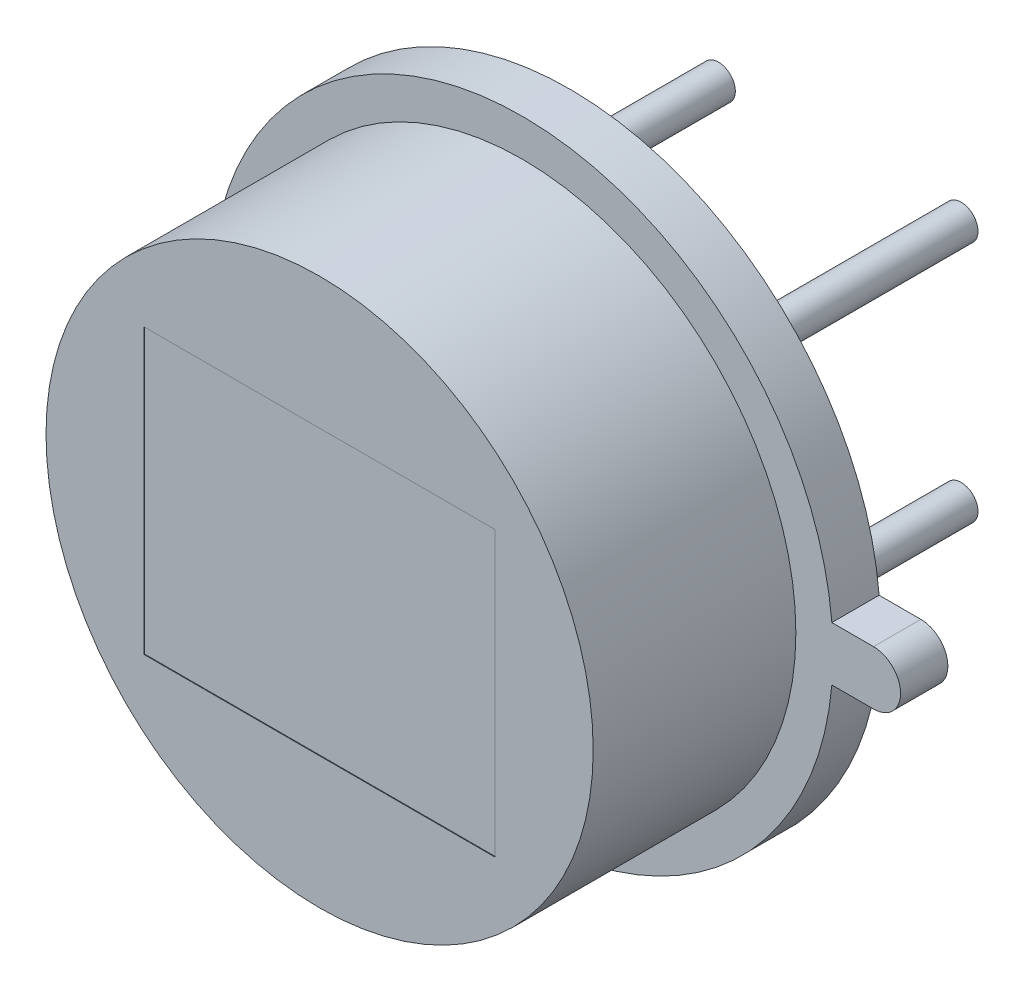
ISO-10303-21;
HEADER;
FILE_DESCRIPTION(('STEP AP214'),'2;1');
FILE_NAME('part.step','',(''),(''),'','','');
FILE_SCHEMA(('AUTOMOTIVE_DESIGN { 1 0 10303 214 1 1 1 1 }'));
ENDSEC;
DATA;
#1=APPLICATION_CONTEXT('core data for automotive mechanical design processes');
#2=APPLICATION_PROTOCOL_DEFINITION('international standard','automotive_design',2000,#1);
#3=PRODUCT_CONTEXT('',#1,'mechanical');
#4=PRODUCT('Part','Part','',(#3));
#5=PRODUCT_RELATED_PRODUCT_CATEGORY('part','',(#4));
#6=PRODUCT_DEFINITION_FORMATION('','',#4);
#7=PRODUCT_DEFINITION_CONTEXT('part definition',#1,'design');
#8=PRODUCT_DEFINITION('design','',#6,#7);
#9=PRODUCT_DEFINITION_SHAPE('','',#8);
#10=(LENGTH_UNIT() NAMED_UNIT(*) SI_UNIT(.MILLI.,.METRE.));
#11=(NAMED_UNIT(*) PLANE_ANGLE_UNIT() SI_UNIT($,.RADIAN.));
#12=(NAMED_UNIT(*) SI_UNIT($,.STERADIAN.) SOLID_ANGLE_UNIT());
#13=UNCERTAINTY_MEASURE_WITH_UNIT(LENGTH_MEASURE(1.E-05),#10,'distance_accuracy_value','');
#14=(GEOMETRIC_REPRESENTATION_CONTEXT(3) GLOBAL_UNCERTAINTY_ASSIGNED_CONTEXT((#13)) GLOBAL_UNIT_ASSIGNED_CONTEXT((#10,
#11,#12)) REPRESENTATION_CONTEXT('',''));
#15=CARTESIAN_POINT('',(0.,0.,0.));
#16=DIRECTION('',(0.,0.,1.));
#17=DIRECTION('',(1.,0.,0.));
#18=AXIS2_PLACEMENT_3D('',#15,#16,#17);
#19=CARTESIAN_POINT('',(0.,0.,0.7));
#20=DIRECTION('',(0.,0.,-1.));
#21=DIRECTION('',(-1.,0.,0.));
#22=AXIS2_PLACEMENT_3D('',#19,#20,#21);
#23=CYLINDRICAL_SURFACE('',#22,4.6);
#24=CARTESIAN_POINT('',(0.,0.,0.));
#25=DIRECTION('',(0.,0.,1.));
#26=DIRECTION('',(1.,0.,0.));
#27=AXIS2_PLACEMENT_3D('',#24,#25,#26);
#28=CIRCLE('',#27,4.6);
#29=CARTESIAN_POINT('',(4.58257569495584,0.4,0.));
#30=VERTEX_POINT('',#29);
#31=CARTESIAN_POINT('',(4.58257569495584,-0.4,0.));
#32=VERTEX_POINT('',#31);
#33=EDGE_CURVE('E156',#30,#32,#28,.T.);
#34=ORIENTED_EDGE('',*,*,#33,.T.);
#35=DIRECTION('',(0.,0.,-1.));
#36=VECTOR('',#35,1.);
#37=CARTESIAN_POINT('',(4.58257569495584,-0.4,0.7));
#38=LINE('',#37,#36);
#39=CARTESIAN_POINT('',(4.58257569495584,-0.4,0.7));
#40=VERTEX_POINT('',#39);
#41=EDGE_CURVE('E40',#40,#32,#38,.T.);
#42=ORIENTED_EDGE('',*,*,#41,.F.);
#43=CARTESIAN_POINT('',(0.,0.,0.7));
#44=DIRECTION('',(0.,0.,1.));
#45=DIRECTION('',(1.,0.,0.));
#46=AXIS2_PLACEMENT_3D('',#43,#44,#45);
#47=CIRCLE('',#46,4.6);
#48=CARTESIAN_POINT('',(4.58257569495584,0.4,0.7));
#49=VERTEX_POINT('',#48);
#50=EDGE_CURVE('E158',#49,#40,#47,.T.);
#51=ORIENTED_EDGE('',*,*,#50,.F.);
#52=DIRECTION('',(0.,0.,-1.));
#53=VECTOR('',#52,1.);
#54=CARTESIAN_POINT('',(4.58257569495584,0.4,0.7));
#55=LINE('',#54,#53);
#56=EDGE_CURVE('E164',#49,#30,#55,.T.);
#57=ORIENTED_EDGE('',*,*,#56,.T.);
#58=EDGE_LOOP('',(#34,#42,#51,#57));
#59=FACE_BOUND('',#58,.T.);
#60=ADVANCED_FACE('F37',(#59),#23,.T.);
#61=CARTESIAN_POINT('',(5.2,-0.4,0.7));
#62=DIRECTION('',(0.,1.,0.));
#63=DIRECTION('',(-1.,0.,0.));
#64=AXIS2_PLACEMENT_3D('',#61,#62,#63);
#65=PLANE('',#64);
#66=DIRECTION('',(1.,0.,0.));
#67=VECTOR('',#66,1.);
#68=CARTESIAN_POINT('',(5.2,-0.4,0.));
#69=LINE('',#68,#67);
#70=CARTESIAN_POINT('',(5.2,-0.4,0.));
#71=VERTEX_POINT('',#70);
#72=EDGE_CURVE('E167',#32,#71,#69,.T.);
#73=ORIENTED_EDGE('',*,*,#72,.T.);
#74=DIRECTION('',(0.,0.,-1.));
#75=VECTOR('',#74,1.);
#76=CARTESIAN_POINT('',(5.2,-0.4,0.7));
#77=LINE('',#76,#75);
#78=CARTESIAN_POINT('',(5.2,-0.4,0.7));
#79=VERTEX_POINT('',#78);
#80=EDGE_CURVE('E174',#79,#71,#77,.T.);
#81=ORIENTED_EDGE('',*,*,#80,.F.);
#82=DIRECTION('',(1.,0.,0.));
#83=VECTOR('',#82,1.);
#84=CARTESIAN_POINT('',(5.2,-0.4,0.7));
#85=LINE('',#84,#83);
#86=EDGE_CURVE('E90',#40,#79,#85,.T.);
#87=ORIENTED_EDGE('',*,*,#86,.F.);
#88=ORIENTED_EDGE('',*,*,#41,.T.);
#89=EDGE_LOOP('',(#73,#81,#87,#88));
#90=FACE_BOUND('',#89,.T.);
#91=ADVANCED_FACE('F180',(#90),#65,.F.);
#92=CARTESIAN_POINT('',(5.2,0.,0.7));
#93=DIRECTION('',(0.,0.,-1.));
#94=DIRECTION('',(-1.,0.,0.));
#95=AXIS2_PLACEMENT_3D('',#92,#93,#94);
#96=CYLINDRICAL_SURFACE('',#95,0.4);
#97=CARTESIAN_POINT('',(5.2,0.,0.));
#98=DIRECTION('',(0.,0.,1.));
#99=DIRECTION('',(1.,0.,0.));
#100=AXIS2_PLACEMENT_3D('',#97,#98,#99);
#101=CIRCLE('',#100,0.4);
#102=CARTESIAN_POINT('',(5.2,0.4,0.));
#103=VERTEX_POINT('',#102);
#104=EDGE_CURVE('E169',#71,#103,#101,.T.);
#105=ORIENTED_EDGE('',*,*,#104,.T.);
#106=DIRECTION('',(0.,0.,-1.));
#107=VECTOR('',#106,1.);
#108=CARTESIAN_POINT('',(5.2,0.4,0.7));
#109=LINE('',#108,#107);
#110=CARTESIAN_POINT('',(5.2,0.4,0.7));
#111=VERTEX_POINT('',#110);
#112=EDGE_CURVE('E173',#111,#103,#109,.T.);
#113=ORIENTED_EDGE('',*,*,#112,.F.);
#114=CARTESIAN_POINT('',(5.2,0.,0.7));
#115=DIRECTION('',(0.,0.,1.));
#116=DIRECTION('',(1.,0.,0.));
#117=AXIS2_PLACEMENT_3D('',#114,#115,#116);
#118=CIRCLE('',#117,0.4);
#119=EDGE_CURVE('E161',#79,#111,#118,.T.);
#120=ORIENTED_EDGE('',*,*,#119,.F.);
#121=ORIENTED_EDGE('',*,*,#80,.T.);
#122=EDGE_LOOP('',(#105,#113,#120,#121));
#123=FACE_BOUND('',#122,.T.);
#124=ADVANCED_FACE('F187',(#123),#96,.T.);
#125=CARTESIAN_POINT('',(5.2,0.4,0.7));
#126=DIRECTION('',(0.,-1.,0.));
#127=DIRECTION('',(1.,0.,0.));
#128=AXIS2_PLACEMENT_3D('',#125,#126,#127);
#129=PLANE('',#128);
#130=DIRECTION('',(-1.,0.,0.));
#131=VECTOR('',#130,1.);
#132=CARTESIAN_POINT('',(5.2,0.4,0.));
#133=LINE('',#132,#131);
#134=EDGE_CURVE('E82',#103,#30,#133,.T.);
#135=ORIENTED_EDGE('',*,*,#134,.T.);
#136=ORIENTED_EDGE('',*,*,#56,.F.);
#137=DIRECTION('',(-1.,0.,0.));
#138=VECTOR('',#137,1.);
#139=CARTESIAN_POINT('',(5.2,0.4,0.7));
#140=LINE('',#139,#138);
#141=EDGE_CURVE('E61',#111,#49,#140,.T.);
#142=ORIENTED_EDGE('',*,*,#141,.F.);
#143=ORIENTED_EDGE('',*,*,#112,.T.);
#144=EDGE_LOOP('',(#135,#136,#142,#143));
#145=FACE_BOUND('',#144,.T.);
#146=ADVANCED_FACE('F188',(#145),#129,.F.);
#147=CARTESIAN_POINT('',(0.,0.,0.7));
#148=DIRECTION('',(0.,0.,1.));
#149=DIRECTION('',(1.,0.,0.));
#150=AXIS2_PLACEMENT_3D('',#147,#148,#149);
#151=PLANE('',#150);
#152=CARTESIAN_POINT('',(0.,0.,0.7));
#153=DIRECTION('',(0.,0.,1.));
#154=DIRECTION('',(1.,0.,0.));
#155=AXIS2_PLACEMENT_3D('',#152,#153,#154);
#156=CIRCLE('',#155,4.05);
#157=CARTESIAN_POINT('',(4.05,0.,0.7));
#158=VERTEX_POINT('',#157);
#159=EDGE_CURVE('E11',#158,#158,#156,.T.);
#160=ORIENTED_EDGE('',*,*,#159,.F.);
#161=EDGE_LOOP('',(#160));
#162=FACE_BOUND('',#161,.T.);
#163=ORIENTED_EDGE('',*,*,#50,.T.);
#164=ORIENTED_EDGE('',*,*,#86,.T.);
#165=ORIENTED_EDGE('',*,*,#119,.T.);
#166=ORIENTED_EDGE('',*,*,#141,.T.);
#167=EDGE_LOOP('',(#163,#164,#165,#166));
#168=FACE_BOUND('',#167,.T.);
#169=ADVANCED_FACE('F189',(#162,#168),#151,.T.);
#170=CARTESIAN_POINT('',(0.,0.,0.));
#171=DIRECTION('',(0.,0.,1.));
#172=DIRECTION('',(1.,0.,0.));
#173=AXIS2_PLACEMENT_3D('',#170,#171,#172);
#174=PLANE('',#173);
#175=CARTESIAN_POINT('',(-1.796,-1.796,0.));
#176=DIRECTION('',(0.,0.,1.));
#177=DIRECTION('',(1.,0.,0.));
#178=AXIS2_PLACEMENT_3D('',#175,#176,#177);
#179=CIRCLE('',#178,0.25);
#180=CARTESIAN_POINT('',(-1.546,-1.796,0.));
#181=VERTEX_POINT('',#180);
#182=EDGE_CURVE('E378',#181,#181,#179,.T.);
#183=ORIENTED_EDGE('',*,*,#182,.T.);
#184=EDGE_LOOP('',(#183));
#185=FACE_BOUND('',#184,.T.);
#186=CARTESIAN_POINT('',(-1.796,1.796,0.));
#187=DIRECTION('',(0.,0.,1.));
#188=DIRECTION('',(1.,0.,0.));
#189=AXIS2_PLACEMENT_3D('',#186,#187,#188);
#190=CIRCLE('',#189,0.25);
#191=CARTESIAN_POINT('',(-1.546,1.796,0.));
#192=VERTEX_POINT('',#191);
#193=EDGE_CURVE('E377',#192,#192,#190,.T.);
#194=ORIENTED_EDGE('',*,*,#193,.T.);
#195=EDGE_LOOP('',(#194));
#196=FACE_BOUND('',#195,.T.);
#197=CARTESIAN_POINT('',(1.796,1.796,0.));
#198=DIRECTION('',(0.,0.,1.));
#199=DIRECTION('',(1.,0.,0.));
#200=AXIS2_PLACEMENT_3D('',#197,#198,#199);
#201=CIRCLE('',#200,0.25);
#202=CARTESIAN_POINT('',(2.046,1.796,0.));
#203=VERTEX_POINT('',#202);
#204=EDGE_CURVE('E387',#203,#203,#201,.T.);
#205=ORIENTED_EDGE('',*,*,#204,.T.);
#206=EDGE_LOOP('',(#205));
#207=FACE_BOUND('',#206,.T.);
#208=CARTESIAN_POINT('',(1.796,-1.796,0.));
#209=DIRECTION('',(0.,0.,1.));
#210=DIRECTION('',(1.,0.,0.));
#211=AXIS2_PLACEMENT_3D('',#208,#209,#210);
#212=CIRCLE('',#211,0.25);
#213=CARTESIAN_POINT('',(2.046,-1.796,0.));
#214=VERTEX_POINT('',#213);
#215=EDGE_CURVE('E138',#214,#214,#212,.T.);
#216=ORIENTED_EDGE('',*,*,#215,.T.);
#217=EDGE_LOOP('',(#216));
#218=FACE_BOUND('',#217,.T.);
#219=ORIENTED_EDGE('',*,*,#33,.F.);
#220=ORIENTED_EDGE('',*,*,#134,.F.);
#221=ORIENTED_EDGE('',*,*,#104,.F.);
#222=ORIENTED_EDGE('',*,*,#72,.F.);
#223=EDGE_LOOP('',(#219,#220,#221,#222));
#224=FACE_BOUND('',#223,.T.);
#225=ADVANCED_FACE('F185',(#185,#196,#207,#218,#224),#174,.F.);
#226=CARTESIAN_POINT('',(0.,0.,3.7));
#227=DIRECTION('',(0.,0.,-1.));
#228=DIRECTION('',(-1.,0.,0.));
#229=AXIS2_PLACEMENT_3D('',#226,#227,#228);
#230=CYLINDRICAL_SURFACE('',#229,4.05);
#231=CARTESIAN_POINT('',(0.,0.,3.7));
#232=DIRECTION('',(0.,0.,1.));
#233=DIRECTION('',(1.,0.,0.));
#234=AXIS2_PLACEMENT_3D('',#231,#232,#233);
#235=CIRCLE('',#234,4.05);
#236=CARTESIAN_POINT('',(4.05,0.,3.7));
#237=VERTEX_POINT('',#236);
#238=EDGE_CURVE('E151',#237,#237,#235,.T.);
#239=ORIENTED_EDGE('',*,*,#238,.F.);
#240=EDGE_LOOP('',(#239));
#241=FACE_BOUND('',#240,.T.);
#242=ORIENTED_EDGE('',*,*,#159,.T.);
#243=EDGE_LOOP('',(#242));
#244=FACE_BOUND('',#243,.T.);
#245=ADVANCED_FACE('F197',(#241,#244),#230,.T.);
#246=CARTESIAN_POINT('',(0.,0.,3.7));
#247=DIRECTION('',(0.,0.,1.));
#248=DIRECTION('',(1.,0.,0.));
#249=AXIS2_PLACEMENT_3D('',#246,#247,#248);
#250=PLANE('',#249);
#251=DIRECTION('',(0.,1.,0.));
#252=VECTOR('',#251,1.);
#253=CARTESIAN_POINT('',(2.6,-2.1,3.7));
#254=LINE('',#253,#252);
#255=CARTESIAN_POINT('',(2.6,-2.1,3.7));
#256=VERTEX_POINT('',#255);
#257=CARTESIAN_POINT('',(2.6,2.1,3.7));
#258=VERTEX_POINT('',#257);
#259=EDGE_CURVE('E52',#256,#258,#254,.T.);
#260=ORIENTED_EDGE('',*,*,#259,.F.);
#261=DIRECTION('',(1.,0.,0.));
#262=VECTOR('',#261,1.);
#263=CARTESIAN_POINT('',(-2.6,-2.1,3.7));
#264=LINE('',#263,#262);
#265=CARTESIAN_POINT('',(-2.6,-2.1,3.7));
#266=VERTEX_POINT('',#265);
#267=EDGE_CURVE('E132',#266,#256,#264,.T.);
#268=ORIENTED_EDGE('',*,*,#267,.F.);
#269=DIRECTION('',(0.,-1.,0.));
#270=VECTOR('',#269,1.);
#271=CARTESIAN_POINT('',(-2.6,-2.1,3.7));
#272=LINE('',#271,#270);
#273=CARTESIAN_POINT('',(-2.6,2.1,3.7));
#274=VERTEX_POINT('',#273);
#275=EDGE_CURVE('E135',#274,#266,#272,.T.);
#276=ORIENTED_EDGE('',*,*,#275,.F.);
#277=DIRECTION('',(-1.,0.,0.));
#278=VECTOR('',#277,1.);
#279=CARTESIAN_POINT('',(-2.6,2.1,3.7));
#280=LINE('',#279,#278);
#281=EDGE_CURVE('E144',#258,#274,#280,.T.);
#282=ORIENTED_EDGE('',*,*,#281,.F.);
#283=EDGE_LOOP('',(#260,#268,#276,#282));
#284=FACE_BOUND('',#283,.T.);
#285=ORIENTED_EDGE('',*,*,#238,.T.);
#286=EDGE_LOOP('',(#285));
#287=FACE_BOUND('',#286,.T.);
#288=ADVANCED_FACE('F231',(#284,#287),#250,.T.);
#289=CARTESIAN_POINT('',(2.6,-2.1,3.69));
#290=DIRECTION('',(1.,0.,0.));
#291=DIRECTION('',(0.,0.,-1.));
#292=AXIS2_PLACEMENT_3D('',#289,#290,#291);
#293=PLANE('',#292);
#294=ORIENTED_EDGE('',*,*,#259,.T.);
#295=DIRECTION('',(0.,0.,1.));
#296=VECTOR('',#295,1.);
#297=CARTESIAN_POINT('',(2.6,2.1,3.69));
#298=LINE('',#297,#296);
#299=CARTESIAN_POINT('',(2.6,2.1,3.69));
#300=VERTEX_POINT('',#299);
#301=EDGE_CURVE('E110',#300,#258,#298,.T.);
#302=ORIENTED_EDGE('',*,*,#301,.F.);
#303=DIRECTION('',(0.,1.,0.));
#304=VECTOR('',#303,1.);
#305=CARTESIAN_POINT('',(2.6,-2.1,3.69));
#306=LINE('',#305,#304);
#307=CARTESIAN_POINT('',(2.6,-2.1,3.69));
#308=VERTEX_POINT('',#307);
#309=EDGE_CURVE('E114',#308,#300,#306,.T.);
#310=ORIENTED_EDGE('',*,*,#309,.F.);
#311=DIRECTION('',(0.,0.,1.));
#312=VECTOR('',#311,1.);
#313=CARTESIAN_POINT('',(2.6,-2.1,3.69));
#314=LINE('',#313,#312);
#315=EDGE_CURVE('E149',#308,#256,#314,.T.);
#316=ORIENTED_EDGE('',*,*,#315,.T.);
#317=EDGE_LOOP('',(#294,#302,#310,#316));
#318=FACE_BOUND('',#317,.T.);
#319=ADVANCED_FACE('F112',(#318),#293,.F.);
#320=CARTESIAN_POINT('',(-2.6,-2.1,3.69));
#321=DIRECTION('',(0.,-1.,0.));
#322=DIRECTION('',(0.,0.,-1.));
#323=AXIS2_PLACEMENT_3D('',#320,#321,#322);
#324=PLANE('',#323);
#325=ORIENTED_EDGE('',*,*,#267,.T.);
#326=ORIENTED_EDGE('',*,*,#315,.F.);
#327=DIRECTION('',(1.,0.,0.));
#328=VECTOR('',#327,1.);
#329=CARTESIAN_POINT('',(-2.6,-2.1,3.69));
#330=LINE('',#329,#328);
#331=CARTESIAN_POINT('',(-2.6,-2.1,3.69));
#332=VERTEX_POINT('',#331);
#333=EDGE_CURVE('E120',#332,#308,#330,.T.);
#334=ORIENTED_EDGE('',*,*,#333,.F.);
#335=DIRECTION('',(0.,0.,1.));
#336=VECTOR('',#335,1.);
#337=CARTESIAN_POINT('',(-2.6,-2.1,3.69));
#338=LINE('',#337,#336);
#339=EDGE_CURVE('E152',#332,#266,#338,.T.);
#340=ORIENTED_EDGE('',*,*,#339,.T.);
#341=EDGE_LOOP('',(#325,#326,#334,#340));
#342=FACE_BOUND('',#341,.T.);
#343=ADVANCED_FACE('F249',(#342),#324,.F.);
#344=CARTESIAN_POINT('',(-2.6,-2.1,3.69));
#345=DIRECTION('',(-1.,0.,0.));
#346=DIRECTION('',(0.,0.,1.));
#347=AXIS2_PLACEMENT_3D('',#344,#345,#346);
#348=PLANE('',#347);
#349=ORIENTED_EDGE('',*,*,#275,.T.);
#350=ORIENTED_EDGE('',*,*,#339,.F.);
#351=DIRECTION('',(0.,-1.,0.));
#352=VECTOR('',#351,1.);
#353=CARTESIAN_POINT('',(-2.6,-2.1,3.69));
#354=LINE('',#353,#352);
#355=CARTESIAN_POINT('',(-2.6,2.1,3.69));
#356=VERTEX_POINT('',#355);
#357=EDGE_CURVE('E128',#356,#332,#354,.T.);
#358=ORIENTED_EDGE('',*,*,#357,.F.);
#359=DIRECTION('',(0.,0.,1.));
#360=VECTOR('',#359,1.);
#361=CARTESIAN_POINT('',(-2.6,2.1,3.69));
#362=LINE('',#361,#360);
#363=EDGE_CURVE('E119',#356,#274,#362,.T.);
#364=ORIENTED_EDGE('',*,*,#363,.T.);
#365=EDGE_LOOP('',(#349,#350,#358,#364));
#366=FACE_BOUND('',#365,.T.);
#367=ADVANCED_FACE('F258',(#366),#348,.F.);
#368=CARTESIAN_POINT('',(-2.6,2.1,3.69));
#369=DIRECTION('',(0.,1.,0.));
#370=DIRECTION('',(0.,0.,1.));
#371=AXIS2_PLACEMENT_3D('',#368,#369,#370);
#372=PLANE('',#371);
#373=ORIENTED_EDGE('',*,*,#281,.T.);
#374=ORIENTED_EDGE('',*,*,#363,.F.);
#375=DIRECTION('',(-1.,0.,0.));
#376=VECTOR('',#375,1.);
#377=CARTESIAN_POINT('',(-2.6,2.1,3.69));
#378=LINE('',#377,#376);
#379=EDGE_CURVE('E123',#300,#356,#378,.T.);
#380=ORIENTED_EDGE('',*,*,#379,.F.);
#381=ORIENTED_EDGE('',*,*,#301,.T.);
#382=EDGE_LOOP('',(#373,#374,#380,#381));
#383=FACE_BOUND('',#382,.T.);
#384=ADVANCED_FACE('F124',(#383),#372,.F.);
#385=CARTESIAN_POINT('',(0.,0.,3.69));
#386=DIRECTION('',(0.,0.,-1.));
#387=DIRECTION('',(-1.,0.,0.));
#388=AXIS2_PLACEMENT_3D('',#385,#386,#387);
#389=PLANE('',#388);
#390=ORIENTED_EDGE('',*,*,#309,.T.);
#391=ORIENTED_EDGE('',*,*,#379,.T.);
#392=ORIENTED_EDGE('',*,*,#357,.T.);
#393=ORIENTED_EDGE('',*,*,#333,.T.);
#394=EDGE_LOOP('',(#390,#391,#392,#393));
#395=FACE_BOUND('',#394,.T.);
#396=ADVANCED_FACE('F130',(#395),#389,.F.);
#397=CARTESIAN_POINT('',(1.796,-1.796,-4.));
#398=DIRECTION('',(0.,0.,1.));
#399=DIRECTION('',(1.,0.,0.));
#400=AXIS2_PLACEMENT_3D('',#397,#398,#399);
#401=CYLINDRICAL_SURFACE('',#400,0.25);
#402=CARTESIAN_POINT('',(1.796,-1.796,-4.));
#403=DIRECTION('',(0.,0.,1.));
#404=DIRECTION('',(1.,0.,0.));
#405=AXIS2_PLACEMENT_3D('',#402,#403,#404);
#406=CIRCLE('',#405,0.25);
#407=CARTESIAN_POINT('',(2.046,-1.796,-4.));
#408=VERTEX_POINT('',#407);
#409=EDGE_CURVE('E145',#408,#408,#406,.T.);
#410=ORIENTED_EDGE('',*,*,#409,.T.);
#411=EDGE_LOOP('',(#410));
#412=FACE_BOUND('',#411,.T.);
#413=ORIENTED_EDGE('',*,*,#215,.F.);
#414=EDGE_LOOP('',(#413));
#415=FACE_BOUND('',#414,.T.);
#416=ADVANCED_FACE('F285',(#412,#415),#401,.T.);
#417=CARTESIAN_POINT('',(1.796,-1.796,-4.));
#418=DIRECTION('',(0.,0.,1.));
#419=DIRECTION('',(1.,0.,0.));
#420=AXIS2_PLACEMENT_3D('',#417,#418,#419);
#421=PLANE('',#420);
#422=ORIENTED_EDGE('',*,*,#409,.F.);
#423=EDGE_LOOP('',(#422));
#424=FACE_BOUND('',#423,.T.);
#425=ADVANCED_FACE('F300',(#424),#421,.F.);
#426=CARTESIAN_POINT('',(1.796,1.796,-4.));
#427=DIRECTION('',(0.,0.,1.));
#428=DIRECTION('',(1.,0.,0.));
#429=AXIS2_PLACEMENT_3D('',#426,#427,#428);
#430=CYLINDRICAL_SURFACE('',#429,0.25);
#431=CARTESIAN_POINT('',(1.796,1.796,-4.));
#432=DIRECTION('',(0.,0.,1.));
#433=DIRECTION('',(1.,0.,0.));
#434=AXIS2_PLACEMENT_3D('',#431,#432,#433);
#435=CIRCLE('',#434,0.25);
#436=CARTESIAN_POINT('',(2.046,1.796,-4.));
#437=VERTEX_POINT('',#436);
#438=EDGE_CURVE('E389',#437,#437,#435,.T.);
#439=ORIENTED_EDGE('',*,*,#438,.T.);
#440=EDGE_LOOP('',(#439));
#441=FACE_BOUND('',#440,.T.);
#442=ORIENTED_EDGE('',*,*,#204,.F.);
#443=EDGE_LOOP('',(#442));
#444=FACE_BOUND('',#443,.T.);
#445=ADVANCED_FACE('F310',(#441,#444),#430,.T.);
#446=CARTESIAN_POINT('',(1.796,1.796,-4.));
#447=DIRECTION('',(0.,0.,1.));
#448=DIRECTION('',(1.,0.,0.));
#449=AXIS2_PLACEMENT_3D('',#446,#447,#448);
#450=PLANE('',#449);
#451=ORIENTED_EDGE('',*,*,#438,.F.);
#452=EDGE_LOOP('',(#451));
#453=FACE_BOUND('',#452,.T.);
#454=ADVANCED_FACE('F320',(#453),#450,.F.);
#455=CARTESIAN_POINT('',(-1.796,1.796,-4.));
#456=DIRECTION('',(0.,0.,1.));
#457=DIRECTION('',(1.,0.,0.));
#458=AXIS2_PLACEMENT_3D('',#455,#456,#457);
#459=CYLINDRICAL_SURFACE('',#458,0.25);
#460=CARTESIAN_POINT('',(-1.796,1.796,-4.));
#461=DIRECTION('',(0.,0.,1.));
#462=DIRECTION('',(1.,0.,0.));
#463=AXIS2_PLACEMENT_3D('',#460,#461,#462);
#464=CIRCLE('',#463,0.25);
#465=CARTESIAN_POINT('',(-1.546,1.796,-4.));
#466=VERTEX_POINT('',#465);
#467=EDGE_CURVE('E381',#466,#466,#464,.T.);
#468=ORIENTED_EDGE('',*,*,#467,.T.);
#469=EDGE_LOOP('',(#468));
#470=FACE_BOUND('',#469,.T.);
#471=ORIENTED_EDGE('',*,*,#193,.F.);
#472=EDGE_LOOP('',(#471));
#473=FACE_BOUND('',#472,.T.);
#474=ADVANCED_FACE('F330',(#470,#473),#459,.T.);
#475=CARTESIAN_POINT('',(-1.796,1.796,-4.));
#476=DIRECTION('',(0.,0.,1.));
#477=DIRECTION('',(1.,0.,0.));
#478=AXIS2_PLACEMENT_3D('',#475,#476,#477);
#479=PLANE('',#478);
#480=ORIENTED_EDGE('',*,*,#467,.F.);
#481=EDGE_LOOP('',(#480));
#482=FACE_BOUND('',#481,.T.);
#483=ADVANCED_FACE('F340',(#482),#479,.F.);
#484=CARTESIAN_POINT('',(-1.796,-1.796,-4.));
#485=DIRECTION('',(0.,0.,1.));
#486=DIRECTION('',(1.,0.,0.));
#487=AXIS2_PLACEMENT_3D('',#484,#485,#486);
#488=CYLINDRICAL_SURFACE('',#487,0.25);
#489=CARTESIAN_POINT('',(-1.796,-1.796,-4.));
#490=DIRECTION('',(0.,0.,1.));
#491=DIRECTION('',(1.,0.,0.));
#492=AXIS2_PLACEMENT_3D('',#489,#490,#491);
#493=CIRCLE('',#492,0.25);
#494=CARTESIAN_POINT('',(-1.546,-1.796,-4.));
#495=VERTEX_POINT('',#494);
#496=EDGE_CURVE('E376',#495,#495,#493,.T.);
#497=ORIENTED_EDGE('',*,*,#496,.T.);
#498=EDGE_LOOP('',(#497));
#499=FACE_BOUND('',#498,.T.);
#500=ORIENTED_EDGE('',*,*,#182,.F.);
#501=EDGE_LOOP('',(#500));
#502=FACE_BOUND('',#501,.T.);
#503=ADVANCED_FACE('F350',(#499,#502),#488,.T.);
#504=CARTESIAN_POINT('',(-1.796,-1.796,-4.));
#505=DIRECTION('',(0.,0.,1.));
#506=DIRECTION('',(1.,0.,0.));
#507=AXIS2_PLACEMENT_3D('',#504,#505,#506);
#508=PLANE('',#507);
#509=ORIENTED_EDGE('',*,*,#496,.F.);
#510=EDGE_LOOP('',(#509));
#511=FACE_BOUND('',#510,.T.);
#512=ADVANCED_FACE('F360',(#511),#508,.F.);
#513=CLOSED_SHELL('',(#60,#91,#124,#146,#169,#225,#245,#288,#319,#343,#367,#384,#396,#416,#425,
#445,#454,#474,#483,#503,#512));
#514=MANIFOLD_SOLID_BREP('B2',#513);
#515=ADVANCED_BREP_SHAPE_REPRESENTATION('',(#18,#514),#14);
#516=SHAPE_DEFINITION_REPRESENTATION(#9,#515);
ENDSEC;
END-ISO-10303-21;
